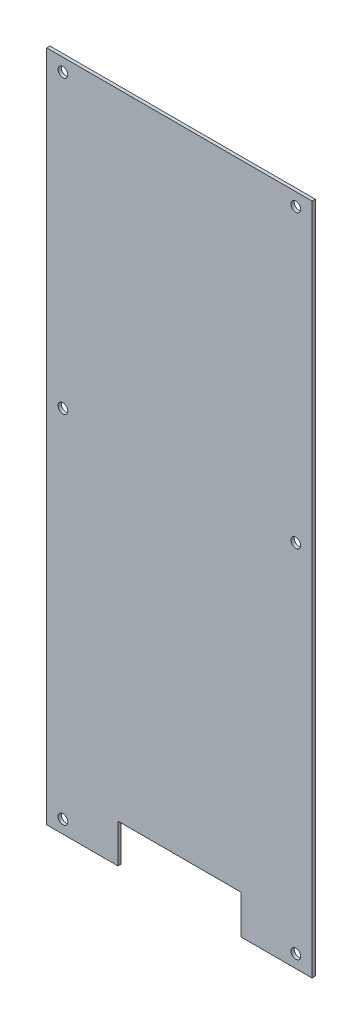
ISO-10303-21;
HEADER;
FILE_DESCRIPTION(('STEP AP214'),'2;1');
FILE_NAME('part.step','',(''),(''),'','','');
FILE_SCHEMA(('AUTOMOTIVE_DESIGN { 1 0 10303 214 1 1 1 1 }'));
ENDSEC;
DATA;
#1=APPLICATION_CONTEXT('core data for automotive mechanical design processes');
#2=APPLICATION_PROTOCOL_DEFINITION('international standard','automotive_design',2000,#1);
#3=PRODUCT_CONTEXT('',#1,'mechanical');
#4=PRODUCT('Part','Part','',(#3));
#5=PRODUCT_RELATED_PRODUCT_CATEGORY('part','',(#4));
#6=PRODUCT_DEFINITION_FORMATION('','',#4);
#7=PRODUCT_DEFINITION_CONTEXT('part definition',#1,'design');
#8=PRODUCT_DEFINITION('design','',#6,#7);
#9=PRODUCT_DEFINITION_SHAPE('','',#8);
#10=(LENGTH_UNIT() NAMED_UNIT(*) SI_UNIT(.MILLI.,.METRE.));
#11=(NAMED_UNIT(*) PLANE_ANGLE_UNIT() SI_UNIT($,.RADIAN.));
#12=(NAMED_UNIT(*) SI_UNIT($,.STERADIAN.) SOLID_ANGLE_UNIT());
#13=UNCERTAINTY_MEASURE_WITH_UNIT(LENGTH_MEASURE(1.E-05),#10,'distance_accuracy_value','');
#14=(GEOMETRIC_REPRESENTATION_CONTEXT(3) GLOBAL_UNCERTAINTY_ASSIGNED_CONTEXT((#13)) GLOBAL_UNIT_ASSIGNED_CONTEXT((#10,
#11,#12)) REPRESENTATION_CONTEXT('',''));
#15=CARTESIAN_POINT('',(0.,0.,0.));
#16=DIRECTION('',(0.,0.,1.));
#17=DIRECTION('',(1.,0.,0.));
#18=AXIS2_PLACEMENT_3D('',#15,#16,#17);
#19=CARTESIAN_POINT('',(41.,-104.,1.));
#20=DIRECTION('',(0.,1.,0.));
#21=DIRECTION('',(-1.,0.,0.));
#22=AXIS2_PLACEMENT_3D('',#19,#20,#21);
#23=PLANE('',#22);
#24=DIRECTION('',(1.,0.,0.));
#25=VECTOR('',#24,1.);
#26=CARTESIAN_POINT('',(41.,-104.,0.));
#27=LINE('',#26,#25);
#28=CARTESIAN_POINT('',(-41.,-104.,0.));
#29=VERTEX_POINT('',#28);
#30=CARTESIAN_POINT('',(-19.,-104.,0.));
#31=VERTEX_POINT('',#30);
#32=EDGE_CURVE('E129',#29,#31,#27,.T.);
#33=ORIENTED_EDGE('',*,*,#32,.T.);
#34=DIRECTION('',(0.,0.,1.));
#35=VECTOR('',#34,1.);
#36=CARTESIAN_POINT('',(-19.,-104.,-9.));
#37=LINE('',#36,#35);
#38=CARTESIAN_POINT('',(-19.,-104.,1.));
#39=VERTEX_POINT('',#38);
#40=EDGE_CURVE('E121',#31,#39,#37,.T.);
#41=ORIENTED_EDGE('',*,*,#40,.T.);
#42=DIRECTION('',(1.,0.,0.));
#43=VECTOR('',#42,1.);
#44=CARTESIAN_POINT('',(41.,-104.,1.));
#45=LINE('',#44,#43);
#46=CARTESIAN_POINT('',(-41.,-104.,1.));
#47=VERTEX_POINT('',#46);
#48=EDGE_CURVE('E97',#47,#39,#45,.T.);
#49=ORIENTED_EDGE('',*,*,#48,.F.);
#50=DIRECTION('',(0.,0.,-1.));
#51=VECTOR('',#50,1.);
#52=CARTESIAN_POINT('',(-41.,-104.,1.));
#53=LINE('',#52,#51);
#54=EDGE_CURVE('E162',#47,#29,#53,.T.);
#55=ORIENTED_EDGE('',*,*,#54,.T.);
#56=EDGE_LOOP('',(#33,#41,#49,#55));
#57=FACE_BOUND('',#56,.T.);
#58=ADVANCED_FACE('F44',(#57),#23,.F.);
#59=CARTESIAN_POINT('',(-41.,-104.,1.));
#60=DIRECTION('',(1.,0.,0.));
#61=DIRECTION('',(0.,0.,-1.));
#62=AXIS2_PLACEMENT_3D('',#59,#60,#61);
#63=PLANE('',#62);
#64=DIRECTION('',(0.,-1.,0.));
#65=VECTOR('',#64,1.);
#66=CARTESIAN_POINT('',(-41.,-104.,0.));
#67=LINE('',#66,#65);
#68=CARTESIAN_POINT('',(-41.,104.,0.));
#69=VERTEX_POINT('',#68);
#70=EDGE_CURVE('E147',#69,#29,#67,.T.);
#71=ORIENTED_EDGE('',*,*,#70,.T.);
#72=ORIENTED_EDGE('',*,*,#54,.F.);
#73=DIRECTION('',(0.,-1.,0.));
#74=VECTOR('',#73,1.);
#75=CARTESIAN_POINT('',(-41.,-104.,1.));
#76=LINE('',#75,#74);
#77=CARTESIAN_POINT('',(-41.,104.,1.));
#78=VERTEX_POINT('',#77);
#79=EDGE_CURVE('E136',#78,#47,#76,.T.);
#80=ORIENTED_EDGE('',*,*,#79,.F.);
#81=DIRECTION('',(0.,0.,-1.));
#82=VECTOR('',#81,1.);
#83=CARTESIAN_POINT('',(-41.,104.,1.));
#84=LINE('',#83,#82);
#85=EDGE_CURVE('E146',#78,#69,#84,.T.);
#86=ORIENTED_EDGE('',*,*,#85,.T.);
#87=EDGE_LOOP('',(#71,#72,#80,#86));
#88=FACE_BOUND('',#87,.T.);
#89=ADVANCED_FACE('F46',(#88),#63,.F.);
#90=CARTESIAN_POINT('',(19.,-104.,1.));
#91=VERTEX_POINT('',#90);
#92=CARTESIAN_POINT('',(41.,-104.,1.));
#93=VERTEX_POINT('',#92);
#94=EDGE_CURVE('E139',#91,#93,#45,.T.);
#95=ORIENTED_EDGE('',*,*,#94,.F.);
#96=DIRECTION('',(0.,0.,1.));
#97=VECTOR('',#96,1.);
#98=CARTESIAN_POINT('',(19.,-104.,-9.));
#99=LINE('',#98,#97);
#100=CARTESIAN_POINT('',(19.,-104.,0.));
#101=VERTEX_POINT('',#100);
#102=EDGE_CURVE('E130',#101,#91,#99,.T.);
#103=ORIENTED_EDGE('',*,*,#102,.F.);
#104=CARTESIAN_POINT('',(41.,-104.,0.));
#105=VERTEX_POINT('',#104);
#106=EDGE_CURVE('E150',#101,#105,#27,.T.);
#107=ORIENTED_EDGE('',*,*,#106,.T.);
#108=DIRECTION('',(0.,0.,-1.));
#109=VECTOR('',#108,1.);
#110=CARTESIAN_POINT('',(41.,-104.,1.));
#111=LINE('',#110,#109);
#112=EDGE_CURVE('E159',#93,#105,#111,.T.);
#113=ORIENTED_EDGE('',*,*,#112,.F.);
#114=EDGE_LOOP('',(#95,#103,#107,#113));
#115=FACE_BOUND('',#114,.T.);
#116=ADVANCED_FACE('F234',(#115),#23,.F.);
#117=CARTESIAN_POINT('',(41.,-104.,1.));
#118=DIRECTION('',(-1.,0.,0.));
#119=DIRECTION('',(0.,0.,1.));
#120=AXIS2_PLACEMENT_3D('',#117,#118,#119);
#121=PLANE('',#120);
#122=DIRECTION('',(0.,1.,0.));
#123=VECTOR('',#122,1.);
#124=CARTESIAN_POINT('',(41.,-104.,0.));
#125=LINE('',#124,#123);
#126=CARTESIAN_POINT('',(41.,104.,0.));
#127=VERTEX_POINT('',#126);
#128=EDGE_CURVE('E153',#105,#127,#125,.T.);
#129=ORIENTED_EDGE('',*,*,#128,.T.);
#130=DIRECTION('',(0.,0.,-1.));
#131=VECTOR('',#130,1.);
#132=CARTESIAN_POINT('',(41.,104.,1.));
#133=LINE('',#132,#131);
#134=CARTESIAN_POINT('',(41.,104.,1.));
#135=VERTEX_POINT('',#134);
#136=EDGE_CURVE('E157',#135,#127,#133,.T.);
#137=ORIENTED_EDGE('',*,*,#136,.F.);
#138=DIRECTION('',(0.,1.,0.));
#139=VECTOR('',#138,1.);
#140=CARTESIAN_POINT('',(41.,-104.,1.));
#141=LINE('',#140,#139);
#142=EDGE_CURVE('E138',#93,#135,#141,.T.);
#143=ORIENTED_EDGE('',*,*,#142,.F.);
#144=ORIENTED_EDGE('',*,*,#112,.T.);
#145=EDGE_LOOP('',(#129,#137,#143,#144));
#146=FACE_BOUND('',#145,.T.);
#147=ADVANCED_FACE('F231',(#146),#121,.F.);
#148=CARTESIAN_POINT('',(41.,104.,1.));
#149=DIRECTION('',(0.,-1.,0.));
#150=DIRECTION('',(0.,0.,-1.));
#151=AXIS2_PLACEMENT_3D('',#148,#149,#150);
#152=PLANE('',#151);
#153=DIRECTION('',(-1.,0.,0.));
#154=VECTOR('',#153,1.);
#155=CARTESIAN_POINT('',(41.,104.,0.));
#156=LINE('',#155,#154);
#157=EDGE_CURVE('E89',#127,#69,#156,.T.);
#158=ORIENTED_EDGE('',*,*,#157,.T.);
#159=ORIENTED_EDGE('',*,*,#85,.F.);
#160=DIRECTION('',(-1.,0.,0.));
#161=VECTOR('',#160,1.);
#162=CARTESIAN_POINT('',(41.,104.,1.));
#163=LINE('',#162,#161);
#164=EDGE_CURVE('E68',#135,#78,#163,.T.);
#165=ORIENTED_EDGE('',*,*,#164,.F.);
#166=ORIENTED_EDGE('',*,*,#136,.T.);
#167=EDGE_LOOP('',(#158,#159,#165,#166));
#168=FACE_BOUND('',#167,.T.);
#169=ADVANCED_FACE('F222',(#168),#152,.F.);
#170=CARTESIAN_POINT('',(0.,0.,1.));
#171=DIRECTION('',(0.,0.,1.));
#172=DIRECTION('',(1.,0.,0.));
#173=AXIS2_PLACEMENT_3D('',#170,#171,#172);
#174=PLANE('',#173);
#175=DIRECTION('',(0.,-1.,0.));
#176=VECTOR('',#175,1.);
#177=CARTESIAN_POINT('',(-19.,-92.,1.));
#178=LINE('',#177,#176);
#179=CARTESIAN_POINT('',(-19.,-92.,1.));
#180=VERTEX_POINT('',#179);
#181=EDGE_CURVE('E119',#180,#39,#178,.T.);
#182=ORIENTED_EDGE('',*,*,#181,.F.);
#183=DIRECTION('',(-1.,0.,0.));
#184=VECTOR('',#183,1.);
#185=CARTESIAN_POINT('',(-19.,-92.,1.));
#186=LINE('',#185,#184);
#187=CARTESIAN_POINT('',(19.,-92.,1.));
#188=VERTEX_POINT('',#187);
#189=EDGE_CURVE('E131',#188,#180,#186,.T.);
#190=ORIENTED_EDGE('',*,*,#189,.F.);
#191=DIRECTION('',(0.,1.,0.));
#192=VECTOR('',#191,1.);
#193=CARTESIAN_POINT('',(19.,-92.,1.));
#194=LINE('',#193,#192);
#195=EDGE_CURVE('E126',#91,#188,#194,.T.);
#196=ORIENTED_EDGE('',*,*,#195,.F.);
#197=ORIENTED_EDGE('',*,*,#94,.T.);
#198=ORIENTED_EDGE('',*,*,#142,.T.);
#199=ORIENTED_EDGE('',*,*,#164,.T.);
#200=ORIENTED_EDGE('',*,*,#79,.T.);
#201=ORIENTED_EDGE('',*,*,#48,.T.);
#202=EDGE_LOOP('',(#182,#190,#196,#197,#198,#199,#200,#201));
#203=FACE_BOUND('',#202,.T.);
#204=CARTESIAN_POINT('',(-35.9999999999995,9.99999999999963,1.));
#205=DIRECTION('',(0.,0.,1.));
#206=DIRECTION('',(1.,0.,0.));
#207=AXIS2_PLACEMENT_3D('',#204,#205,#206);
#208=CIRCLE('',#207,1.5);
#209=CARTESIAN_POINT('',(-34.4999999999995,9.99999999999963,1.));
#210=VERTEX_POINT('',#209);
#211=EDGE_CURVE('E172',#210,#210,#208,.T.);
#212=ORIENTED_EDGE('',*,*,#211,.F.);
#213=EDGE_LOOP('',(#212));
#214=FACE_BOUND('',#213,.T.);
#215=CARTESIAN_POINT('',(36.0000000000005,9.99999999999938,1.));
#216=DIRECTION('',(0.,0.,1.));
#217=DIRECTION('',(1.,0.,0.));
#218=AXIS2_PLACEMENT_3D('',#215,#216,#217);
#219=CIRCLE('',#218,1.5);
#220=CARTESIAN_POINT('',(37.5000000000005,9.99999999999938,1.));
#221=VERTEX_POINT('',#220);
#222=EDGE_CURVE('E184',#221,#221,#219,.T.);
#223=ORIENTED_EDGE('',*,*,#222,.F.);
#224=EDGE_LOOP('',(#223));
#225=FACE_BOUND('',#224,.T.);
#226=CARTESIAN_POINT('',(36.0000000000007,-100.,1.));
#227=DIRECTION('',(0.,0.,1.));
#228=DIRECTION('',(1.,0.,0.));
#229=AXIS2_PLACEMENT_3D('',#226,#227,#228);
#230=CIRCLE('',#229,1.5);
#231=CARTESIAN_POINT('',(37.5000000000007,-100.,1.));
#232=VERTEX_POINT('',#231);
#233=EDGE_CURVE('E190',#232,#232,#230,.T.);
#234=ORIENTED_EDGE('',*,*,#233,.F.);
#235=EDGE_LOOP('',(#234));
#236=FACE_BOUND('',#235,.T.);
#237=CARTESIAN_POINT('',(-35.9999999999993,-100.,1.));
#238=DIRECTION('',(0.,0.,1.));
#239=DIRECTION('',(1.,0.,0.));
#240=AXIS2_PLACEMENT_3D('',#237,#238,#239);
#241=CIRCLE('',#240,1.5);
#242=CARTESIAN_POINT('',(-34.4999999999993,-100.,1.));
#243=VERTEX_POINT('',#242);
#244=EDGE_CURVE('E196',#243,#243,#241,.T.);
#245=ORIENTED_EDGE('',*,*,#244,.F.);
#246=EDGE_LOOP('',(#245));
#247=FACE_BOUND('',#246,.T.);
#248=CARTESIAN_POINT('',(-35.9999999999993,99.9999999999994,1.));
#249=DIRECTION('',(0.,0.,1.));
#250=DIRECTION('',(1.,0.,0.));
#251=AXIS2_PLACEMENT_3D('',#248,#249,#250);
#252=CIRCLE('',#251,1.5);
#253=CARTESIAN_POINT('',(-34.4999999999993,99.9999999999994,1.));
#254=VERTEX_POINT('',#253);
#255=EDGE_CURVE('E202',#254,#254,#252,.T.);
#256=ORIENTED_EDGE('',*,*,#255,.F.);
#257=EDGE_LOOP('',(#256));
#258=FACE_BOUND('',#257,.T.);
#259=CARTESIAN_POINT('',(36.0000000000007,99.9999999999992,1.));
#260=DIRECTION('',(0.,0.,1.));
#261=DIRECTION('',(1.,0.,0.));
#262=AXIS2_PLACEMENT_3D('',#259,#260,#261);
#263=CIRCLE('',#262,1.5);
#264=CARTESIAN_POINT('',(37.5000000000007,99.9999999999992,1.));
#265=VERTEX_POINT('',#264);
#266=EDGE_CURVE('E208',#265,#265,#263,.T.);
#267=ORIENTED_EDGE('',*,*,#266,.F.);
#268=EDGE_LOOP('',(#267));
#269=FACE_BOUND('',#268,.T.);
#270=ADVANCED_FACE('F133',(#203,#214,#225,#236,#247,#258,#269),#174,.T.);
#271=CARTESIAN_POINT('',(0.,0.,0.));
#272=DIRECTION('',(0.,0.,1.));
#273=DIRECTION('',(1.,0.,0.));
#274=AXIS2_PLACEMENT_3D('',#271,#272,#273);
#275=PLANE('',#274);
#276=CARTESIAN_POINT('',(-35.9999999999995,9.99999999999963,0.));
#277=DIRECTION('',(0.,0.,1.));
#278=DIRECTION('',(1.,0.,0.));
#279=AXIS2_PLACEMENT_3D('',#276,#277,#278);
#280=CIRCLE('',#279,1.5);
#281=CARTESIAN_POINT('',(-34.4999999999995,9.99999999999963,0.));
#282=VERTEX_POINT('',#281);
#283=EDGE_CURVE('E175',#282,#282,#280,.T.);
#284=ORIENTED_EDGE('',*,*,#283,.T.);
#285=EDGE_LOOP('',(#284));
#286=FACE_BOUND('',#285,.T.);
#287=CARTESIAN_POINT('',(36.0000000000005,9.99999999999938,0.));
#288=DIRECTION('',(0.,0.,1.));
#289=DIRECTION('',(1.,0.,0.));
#290=AXIS2_PLACEMENT_3D('',#287,#288,#289);
#291=CIRCLE('',#290,1.5);
#292=CARTESIAN_POINT('',(37.5000000000005,9.99999999999938,0.));
#293=VERTEX_POINT('',#292);
#294=EDGE_CURVE('E187',#293,#293,#291,.T.);
#295=ORIENTED_EDGE('',*,*,#294,.T.);
#296=EDGE_LOOP('',(#295));
#297=FACE_BOUND('',#296,.T.);
#298=CARTESIAN_POINT('',(36.0000000000007,-100.,0.));
#299=DIRECTION('',(0.,0.,1.));
#300=DIRECTION('',(1.,0.,0.));
#301=AXIS2_PLACEMENT_3D('',#298,#299,#300);
#302=CIRCLE('',#301,1.5);
#303=CARTESIAN_POINT('',(37.5000000000007,-100.,0.));
#304=VERTEX_POINT('',#303);
#305=EDGE_CURVE('E193',#304,#304,#302,.T.);
#306=ORIENTED_EDGE('',*,*,#305,.T.);
#307=EDGE_LOOP('',(#306));
#308=FACE_BOUND('',#307,.T.);
#309=CARTESIAN_POINT('',(-35.9999999999993,-100.,0.));
#310=DIRECTION('',(0.,0.,1.));
#311=DIRECTION('',(1.,0.,0.));
#312=AXIS2_PLACEMENT_3D('',#309,#310,#311);
#313=CIRCLE('',#312,1.5);
#314=CARTESIAN_POINT('',(-34.4999999999993,-100.,0.));
#315=VERTEX_POINT('',#314);
#316=EDGE_CURVE('E199',#315,#315,#313,.T.);
#317=ORIENTED_EDGE('',*,*,#316,.T.);
#318=EDGE_LOOP('',(#317));
#319=FACE_BOUND('',#318,.T.);
#320=CARTESIAN_POINT('',(-35.9999999999993,99.9999999999994,0.));
#321=DIRECTION('',(0.,0.,1.));
#322=DIRECTION('',(1.,0.,0.));
#323=AXIS2_PLACEMENT_3D('',#320,#321,#322);
#324=CIRCLE('',#323,1.5);
#325=CARTESIAN_POINT('',(-34.4999999999993,99.9999999999994,0.));
#326=VERTEX_POINT('',#325);
#327=EDGE_CURVE('E205',#326,#326,#324,.T.);
#328=ORIENTED_EDGE('',*,*,#327,.T.);
#329=EDGE_LOOP('',(#328));
#330=FACE_BOUND('',#329,.T.);
#331=CARTESIAN_POINT('',(36.0000000000007,99.9999999999992,0.));
#332=DIRECTION('',(0.,0.,1.));
#333=DIRECTION('',(1.,0.,0.));
#334=AXIS2_PLACEMENT_3D('',#331,#332,#333);
#335=CIRCLE('',#334,1.5);
#336=CARTESIAN_POINT('',(37.5000000000007,99.9999999999992,0.));
#337=VERTEX_POINT('',#336);
#338=EDGE_CURVE('E151',#337,#337,#335,.T.);
#339=ORIENTED_EDGE('',*,*,#338,.T.);
#340=EDGE_LOOP('',(#339));
#341=FACE_BOUND('',#340,.T.);
#342=DIRECTION('',(-1.,0.,0.));
#343=VECTOR('',#342,1.);
#344=CARTESIAN_POINT('',(0.,-92.,0.));
#345=LINE('',#344,#343);
#346=CARTESIAN_POINT('',(19.,-92.,0.));
#347=VERTEX_POINT('',#346);
#348=CARTESIAN_POINT('',(-19.,-92.,0.));
#349=VERTEX_POINT('',#348);
#350=EDGE_CURVE('E52',#347,#349,#345,.T.);
#351=ORIENTED_EDGE('',*,*,#350,.T.);
#352=DIRECTION('',(0.,-1.,0.));
#353=VECTOR('',#352,1.);
#354=CARTESIAN_POINT('',(-19.,0.,0.));
#355=LINE('',#354,#353);
#356=EDGE_CURVE('E13',#349,#31,#355,.T.);
#357=ORIENTED_EDGE('',*,*,#356,.T.);
#358=ORIENTED_EDGE('',*,*,#32,.F.);
#359=ORIENTED_EDGE('',*,*,#70,.F.);
#360=ORIENTED_EDGE('',*,*,#157,.F.);
#361=ORIENTED_EDGE('',*,*,#128,.F.);
#362=ORIENTED_EDGE('',*,*,#106,.F.);
#363=DIRECTION('',(0.,1.,0.));
#364=VECTOR('',#363,1.);
#365=CARTESIAN_POINT('',(19.,0.,0.));
#366=LINE('',#365,#364);
#367=EDGE_CURVE('E164',#101,#347,#366,.T.);
#368=ORIENTED_EDGE('',*,*,#367,.T.);
#369=EDGE_LOOP('',(#351,#357,#358,#359,#360,#361,#362,#368));
#370=FACE_BOUND('',#369,.T.);
#371=ADVANCED_FACE('F168',(#286,#297,#308,#319,#330,#341,#370),#275,.F.);
#372=CARTESIAN_POINT('',(36.0000000000007,99.9999999999992,1.));
#373=DIRECTION('',(0.,0.,1.));
#374=DIRECTION('',(1.,0.,0.));
#375=AXIS2_PLACEMENT_3D('',#372,#373,#374);
#376=CYLINDRICAL_SURFACE('',#375,1.5);
#377=ORIENTED_EDGE('',*,*,#338,.F.);
#378=EDGE_LOOP('',(#377));
#379=FACE_BOUND('',#378,.T.);
#380=ORIENTED_EDGE('',*,*,#266,.T.);
#381=EDGE_LOOP('',(#380));
#382=FACE_BOUND('',#381,.T.);
#383=ADVANCED_FACE('F214',(#379,#382),#376,.F.);
#384=CARTESIAN_POINT('',(-35.9999999999993,99.9999999999994,1.));
#385=DIRECTION('',(0.,0.,1.));
#386=DIRECTION('',(1.,0.,0.));
#387=AXIS2_PLACEMENT_3D('',#384,#385,#386);
#388=CYLINDRICAL_SURFACE('',#387,1.5);
#389=ORIENTED_EDGE('',*,*,#327,.F.);
#390=EDGE_LOOP('',(#389));
#391=FACE_BOUND('',#390,.T.);
#392=ORIENTED_EDGE('',*,*,#255,.T.);
#393=EDGE_LOOP('',(#392));
#394=FACE_BOUND('',#393,.T.);
#395=ADVANCED_FACE('F217',(#391,#394),#388,.F.);
#396=CARTESIAN_POINT('',(-35.9999999999993,-100.,1.));
#397=DIRECTION('',(0.,0.,1.));
#398=DIRECTION('',(1.,0.,0.));
#399=AXIS2_PLACEMENT_3D('',#396,#397,#398);
#400=CYLINDRICAL_SURFACE('',#399,1.5);
#401=ORIENTED_EDGE('',*,*,#316,.F.);
#402=EDGE_LOOP('',(#401));
#403=FACE_BOUND('',#402,.T.);
#404=ORIENTED_EDGE('',*,*,#244,.T.);
#405=EDGE_LOOP('',(#404));
#406=FACE_BOUND('',#405,.T.);
#407=ADVANCED_FACE('F273',(#403,#406),#400,.F.);
#408=CARTESIAN_POINT('',(36.0000000000007,-100.,1.));
#409=DIRECTION('',(0.,0.,1.));
#410=DIRECTION('',(1.,0.,0.));
#411=AXIS2_PLACEMENT_3D('',#408,#409,#410);
#412=CYLINDRICAL_SURFACE('',#411,1.5);
#413=ORIENTED_EDGE('',*,*,#305,.F.);
#414=EDGE_LOOP('',(#413));
#415=FACE_BOUND('',#414,.T.);
#416=ORIENTED_EDGE('',*,*,#233,.T.);
#417=EDGE_LOOP('',(#416));
#418=FACE_BOUND('',#417,.T.);
#419=ADVANCED_FACE('F269',(#415,#418),#412,.F.);
#420=CARTESIAN_POINT('',(36.0000000000005,9.99999999999938,1.));
#421=DIRECTION('',(0.,0.,1.));
#422=DIRECTION('',(1.,0.,0.));
#423=AXIS2_PLACEMENT_3D('',#420,#421,#422);
#424=CYLINDRICAL_SURFACE('',#423,1.5);
#425=ORIENTED_EDGE('',*,*,#294,.F.);
#426=EDGE_LOOP('',(#425));
#427=FACE_BOUND('',#426,.T.);
#428=ORIENTED_EDGE('',*,*,#222,.T.);
#429=EDGE_LOOP('',(#428));
#430=FACE_BOUND('',#429,.T.);
#431=ADVANCED_FACE('F265',(#427,#430),#424,.F.);
#432=CARTESIAN_POINT('',(-35.9999999999995,9.99999999999963,1.));
#433=DIRECTION('',(0.,0.,1.));
#434=DIRECTION('',(1.,0.,0.));
#435=AXIS2_PLACEMENT_3D('',#432,#433,#434);
#436=CYLINDRICAL_SURFACE('',#435,1.5);
#437=ORIENTED_EDGE('',*,*,#283,.F.);
#438=EDGE_LOOP('',(#437));
#439=FACE_BOUND('',#438,.T.);
#440=ORIENTED_EDGE('',*,*,#211,.T.);
#441=EDGE_LOOP('',(#440));
#442=FACE_BOUND('',#441,.T.);
#443=ADVANCED_FACE('F262',(#439,#442),#436,.F.);
#444=CARTESIAN_POINT('',(-19.,-92.,-9.));
#445=DIRECTION('',(-1.,0.,0.));
#446=DIRECTION('',(0.,0.,1.));
#447=AXIS2_PLACEMENT_3D('',#444,#445,#446);
#448=PLANE('',#447);
#449=DIRECTION('',(0.,0.,1.));
#450=VECTOR('',#449,1.);
#451=CARTESIAN_POINT('',(-19.,-92.,-9.));
#452=LINE('',#451,#450);
#453=EDGE_CURVE('E123',#349,#180,#452,.T.);
#454=ORIENTED_EDGE('',*,*,#453,.T.);
#455=ORIENTED_EDGE('',*,*,#181,.T.);
#456=ORIENTED_EDGE('',*,*,#40,.F.);
#457=ORIENTED_EDGE('',*,*,#356,.F.);
#458=EDGE_LOOP('',(#454,#455,#456,#457));
#459=FACE_BOUND('',#458,.T.);
#460=ADVANCED_FACE('F120',(#459),#448,.F.);
#461=CARTESIAN_POINT('',(-19.,-92.,-9.));
#462=DIRECTION('',(0.,1.,0.));
#463=DIRECTION('',(0.,0.,1.));
#464=AXIS2_PLACEMENT_3D('',#461,#462,#463);
#465=PLANE('',#464);
#466=DIRECTION('',(0.,0.,1.));
#467=VECTOR('',#466,1.);
#468=CARTESIAN_POINT('',(19.,-92.,-9.));
#469=LINE('',#468,#467);
#470=EDGE_CURVE('E59',#347,#188,#469,.T.);
#471=ORIENTED_EDGE('',*,*,#470,.T.);
#472=ORIENTED_EDGE('',*,*,#189,.T.);
#473=ORIENTED_EDGE('',*,*,#453,.F.);
#474=ORIENTED_EDGE('',*,*,#350,.F.);
#475=EDGE_LOOP('',(#471,#472,#473,#474));
#476=FACE_BOUND('',#475,.T.);
#477=ADVANCED_FACE('F171',(#476),#465,.F.);
#478=CARTESIAN_POINT('',(19.,-92.,-9.));
#479=DIRECTION('',(1.,0.,0.));
#480=DIRECTION('',(0.,0.,-1.));
#481=AXIS2_PLACEMENT_3D('',#478,#479,#480);
#482=PLANE('',#481);
#483=ORIENTED_EDGE('',*,*,#102,.T.);
#484=ORIENTED_EDGE('',*,*,#195,.T.);
#485=ORIENTED_EDGE('',*,*,#470,.F.);
#486=ORIENTED_EDGE('',*,*,#367,.F.);
#487=EDGE_LOOP('',(#483,#484,#485,#486));
#488=FACE_BOUND('',#487,.T.);
#489=ADVANCED_FACE('F252',(#488),#482,.F.);
#490=CLOSED_SHELL('',(#58,#89,#116,#147,#169,#270,#371,#383,#395,#407,#419,#431,#443,#460,#477,#489));
#491=MANIFOLD_SOLID_BREP('B2',#490);
#492=ADVANCED_BREP_SHAPE_REPRESENTATION('',(#18,#491),#14);
#493=SHAPE_DEFINITION_REPRESENTATION(#9,#492);
ENDSEC;
END-ISO-10303-21;
